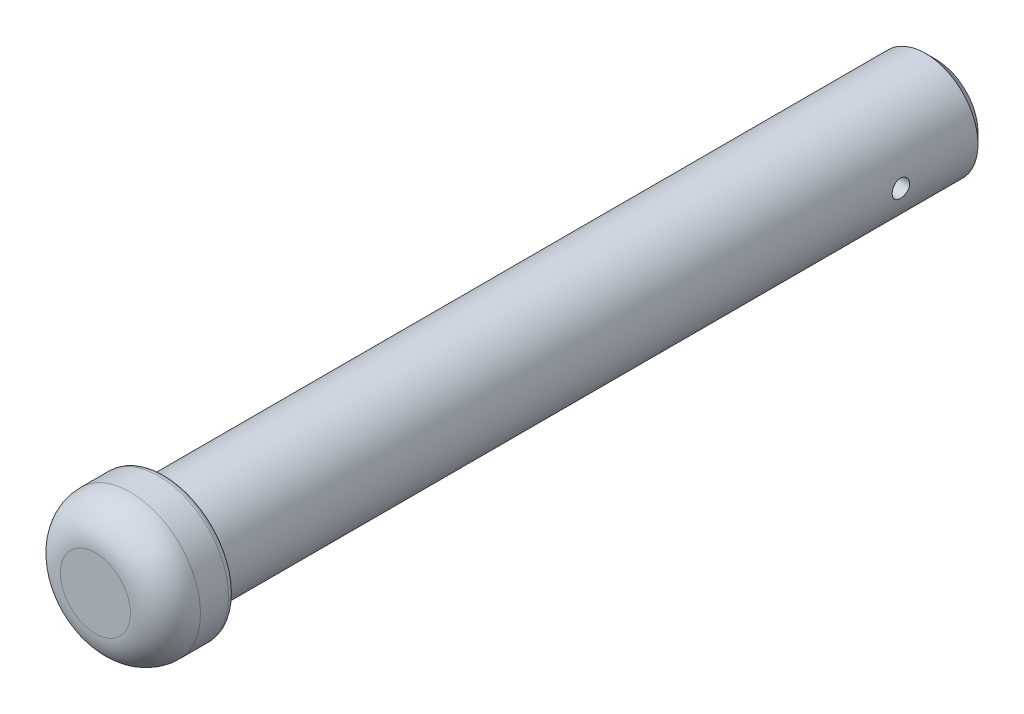
ISO-10303-21;
HEADER;
FILE_DESCRIPTION(('STEP AP214'),'2;1');
FILE_NAME('part.step','',(''),(''),'','','');
FILE_SCHEMA(('AUTOMOTIVE_DESIGN { 1 0 10303 214 1 1 1 1 }'));
ENDSEC;
DATA;
#1=APPLICATION_CONTEXT('core data for automotive mechanical design processes');
#2=APPLICATION_PROTOCOL_DEFINITION('international standard','automotive_design',2000,#1);
#3=PRODUCT_CONTEXT('',#1,'mechanical');
#4=PRODUCT('Part','Part','',(#3));
#5=PRODUCT_RELATED_PRODUCT_CATEGORY('part','',(#4));
#6=PRODUCT_DEFINITION_FORMATION('','',#4);
#7=PRODUCT_DEFINITION_CONTEXT('part definition',#1,'design');
#8=PRODUCT_DEFINITION('design','',#6,#7);
#9=PRODUCT_DEFINITION_SHAPE('','',#8);
#10=(LENGTH_UNIT() NAMED_UNIT(*) SI_UNIT(.MILLI.,.METRE.));
#11=(NAMED_UNIT(*) PLANE_ANGLE_UNIT() SI_UNIT($,.RADIAN.));
#12=(NAMED_UNIT(*) SI_UNIT($,.STERADIAN.) SOLID_ANGLE_UNIT());
#13=UNCERTAINTY_MEASURE_WITH_UNIT(LENGTH_MEASURE(1.E-05),#10,'distance_accuracy_value','');
#14=(GEOMETRIC_REPRESENTATION_CONTEXT(3) GLOBAL_UNCERTAINTY_ASSIGNED_CONTEXT((#13)) GLOBAL_UNIT_ASSIGNED_CONTEXT((#10,
#11,#12)) REPRESENTATION_CONTEXT('',''));
#15=CARTESIAN_POINT('',(0.,0.,0.));
#16=DIRECTION('',(0.,0.,1.));
#17=DIRECTION('',(1.,0.,0.));
#18=AXIS2_PLACEMENT_3D('',#15,#16,#17);
#19=CARTESIAN_POINT('',(0.,0.,220.));
#20=DIRECTION('',(0.,0.,-1.));
#21=DIRECTION('',(-1.,0.,0.));
#22=AXIS2_PLACEMENT_3D('',#19,#20,#21);
#23=CYLINDRICAL_SURFACE('',#22,15.);
#24=CARTESIAN_POINT('',(-15.,0.,27.5));
#25=CARTESIAN_POINT('',(-14.9999976116882,-0.139390904958215,27.4999944110522));
#26=CARTESIAN_POINT('',(-14.9980367791303,-0.278857881838821,27.4883027250311));
#27=CARTESIAN_POINT('',(-14.9904034494139,-0.553880221673043,27.4418643412347));
#28=CARTESIAN_POINT('',(-14.9847275392389,-0.689431867959247,27.4070964430884));
#29=CARTESIAN_POINT('',(-14.9703006823645,-0.952604747212643,27.3155845514072));
#30=CARTESIAN_POINT('',(-14.9615522515919,-1.0802323684319,27.2588585343594));
#31=CARTESIAN_POINT('',(-14.9419422708207,-1.32414184197794,27.1250877079476));
#32=CARTESIAN_POINT('',(-14.9310809625443,-1.44042498987859,27.048045222517));
#33=CARTESIAN_POINT('',(-14.9083331745831,-1.65947261429168,26.8750449161795));
#34=CARTESIAN_POINT('',(-14.8964387181486,-1.76211290353497,26.7789308853639));
#35=CARTESIAN_POINT('',(-14.8730262687673,-1.94988849865993,26.5708520315272));
#36=CARTESIAN_POINT('',(-14.8615082996267,-2.03502269939097,26.4588862085434));
#37=CARTESIAN_POINT('',(-14.8400756575978,-2.18586712560513,26.2214290338029));
#38=CARTESIAN_POINT('',(-14.8301712909164,-2.251454552861,26.0958586631952));
#39=CARTESIAN_POINT('',(-14.8131978979467,-2.36055836541122,25.8352904356994));
#40=CARTESIAN_POINT('',(-14.8061286801431,-2.40407624156561,25.7002932163224));
#41=CARTESIAN_POINT('',(-14.7957053684276,-2.46741437778481,25.4260197251435));
#42=CARTESIAN_POINT('',(-14.792317684857,-2.4874490291354,25.2867942634986));
#43=CARTESIAN_POINT('',(-14.7895393893665,-2.50391672528987,25.0069197231165));
#44=CARTESIAN_POINT('',(-14.7901484945721,-2.50035144038899,24.8662707458327));
#45=CARTESIAN_POINT('',(-14.7952642886355,-2.46989509839615,24.5890721387245));
#46=CARTESIAN_POINT('',(-14.7997307331892,-2.44324488188977,24.4524951964548));
#47=CARTESIAN_POINT('',(-14.8119949521101,-2.36775314040344,24.1857786821709));
#48=CARTESIAN_POINT('',(-14.8197928407327,-2.31891085431974,24.0556393311115));
#49=CARTESIAN_POINT('',(-14.837884793341,-2.20017724609391,23.8047711765591));
#50=CARTESIAN_POINT('',(-14.8481906710733,-2.13018591387971,23.6840905939188));
#51=CARTESIAN_POINT('',(-14.8701291841501,-1.97121201755743,23.4560955994616));
#52=CARTESIAN_POINT('',(-14.8817619265429,-1.88222792065429,23.3487822675451));
#53=CARTESIAN_POINT('',(-14.9052202787979,-1.68648221215905,23.1491739141927));
#54=CARTESIAN_POINT('',(-14.9170464923165,-1.57951396387313,23.0570814814599));
#55=CARTESIAN_POINT('',(-14.9394260139672,-1.35153524898165,22.8921222373347));
#56=CARTESIAN_POINT('',(-14.9499793138975,-1.23052469190642,22.8192555498168));
#57=CARTESIAN_POINT('',(-14.9686389289291,-0.977705916166711,22.6947977728637));
#58=CARTESIAN_POINT('',(-14.9767431840745,-0.845888725564661,22.6432245806687));
#59=CARTESIAN_POINT('',(-14.9895750301266,-0.57529834560273,22.563005784754));
#60=CARTESIAN_POINT('',(-14.9943029035047,-0.436525739179466,22.5343582630263));
#61=CARTESIAN_POINT('',(-14.9998112984269,-0.157709901301621,22.5010786415389));
#62=CARTESIAN_POINT('',(-15.0006375301278,-0.0177007371510094,22.4961684281944));
#63=CARTESIAN_POINT('',(-14.9983747442117,0.261139772889889,22.5097613444281));
#64=CARTESIAN_POINT('',(-14.9952858772412,0.399971163892039,22.5282635731337));
#65=CARTESIAN_POINT('',(-14.985568269382,0.671656175546764,22.5879248493355));
#66=CARTESIAN_POINT('',(-14.9789610480131,0.804540868385379,22.6289462083901));
#67=CARTESIAN_POINT('',(-14.9629446445536,1.06154688486044,22.7323345181995));
#68=CARTESIAN_POINT('',(-14.9535353051202,1.18566771590972,22.7947026676353));
#69=CARTESIAN_POINT('',(-14.9328451630241,1.42283068946896,22.9396511246968));
#70=CARTESIAN_POINT('',(-14.9215485588702,1.53576525093715,23.0224051561673));
#71=CARTESIAN_POINT('',(-14.898384673919,1.74624358550269,23.2055373153851));
#72=CARTESIAN_POINT('',(-14.8865173517155,1.84378623969658,23.3059167232767));
#73=CARTESIAN_POINT('',(-14.8634017523585,2.021742779658,23.5226975480714));
#74=CARTESIAN_POINT('',(-14.8521611613711,2.10196876111371,23.6392541655144));
#75=CARTESIAN_POINT('',(-14.8317152977788,2.24170231029498,23.8843529691385));
#76=CARTESIAN_POINT('',(-14.8225099606602,2.30121053476982,24.0128947752275));
#77=CARTESIAN_POINT('',(-14.807234536977,2.39753833147315,24.2777897328121));
#78=CARTESIAN_POINT('',(-14.8011515431106,2.43445143254794,24.4141080950305));
#79=CARTESIAN_POINT('',(-14.7927771683526,2.48483545377828,24.6911201292218));
#80=CARTESIAN_POINT('',(-14.7904854578272,2.49830841194617,24.8318134197321));
#81=CARTESIAN_POINT('',(-14.7899673308401,2.50137286604735,25.1117051659624));
#82=CARTESIAN_POINT('',(-14.7916905650565,2.49126013612519,25.2509003785753));
#83=CARTESIAN_POINT('',(-14.7988978145373,2.44807983895685,25.5255792480508));
#84=CARTESIAN_POINT('',(-14.8043818176121,2.41501234611248,25.6610629169419));
#85=CARTESIAN_POINT('',(-14.8184735628172,2.3269744895949,25.9243584372926));
#86=CARTESIAN_POINT('',(-14.8270776721967,2.27202959060044,26.052179010056));
#87=CARTESIAN_POINT('',(-14.8464436892221,2.14182700391591,26.2968356691948));
#88=CARTESIAN_POINT('',(-14.857205703884,2.06656830874856,26.4136712103721));
#89=CARTESIAN_POINT('',(-14.8798345404562,1.89681888437216,26.6345355831078));
#90=CARTESIAN_POINT('',(-14.891712955763,1.80211056359365,26.7383960167003));
#91=CARTESIAN_POINT('',(-14.9151437236084,1.59660903138023,26.9288516044749));
#92=CARTESIAN_POINT('',(-14.9266960002655,1.48581211291263,27.0154427686382));
#93=CARTESIAN_POINT('',(-14.9482652964222,1.25036916964028,27.1694482681999));
#94=CARTESIAN_POINT('',(-14.958271162531,1.12563278753282,27.236726039313));
#95=CARTESIAN_POINT('',(-14.9755116760178,0.866513069378982,27.3492694846099));
#96=CARTESIAN_POINT('',(-14.9827490817748,0.73213949483001,27.3945570810797));
#97=CARTESIAN_POINT('',(-14.9920579083296,0.497703310045402,27.4520052741267));
#98=CARTESIAN_POINT('',(-14.9950202727336,0.399058830298448,27.469974469616));
#99=CARTESIAN_POINT('',(-14.9989921598612,0.20028931031981,27.4939737378448));
#100=CARTESIAN_POINT('',(-15.0000017162064,0.100164295608494,27.5000040161374));
#101=CARTESIAN_POINT('',(-15.,0.,27.5));
#102=B_SPLINE_CURVE_WITH_KNOTS('',3,(#24,#25,#26,#27,#28,#29,#30,#31,#32,#33,#34,#35,#36,#37,
#38,#39,#40,#41,#42,#43,#44,#45,#46,#47,#48,#49,#50,#51,#52,#53,#54,#55,#56,#57,#58,#59,#60,#61,
#62,#63,#64,#65,#66,#67,#68,#69,#70,#71,#72,#73,#74,#75,#76,#77,#78,#79,#80,#81,#82,#83,#84,#85,
#86,#87,#88,#89,#90,#91,#92,#93,#94,#95,#96,#97,#98,#99,#100,#101),.UNSPECIFIED.,.T.,.F.,(4,2,2,
2,2,2,2,2,2,2,2,2,2,2,2,2,2,2,2,2,2,2,2,2,2,2,2,2,2,2,2,2,2,2,2,2,2,2,4),(0.,0.417806584938509,
0.835997545695419,1.25384686702527,1.67164841267479,2.09302491062332,2.51442800169857,
2.9384252082384,3.36239376876181,3.78246077103424,4.20249804320886,4.61820521760409,
5.03392665025381,5.45164556632557,5.86939820680573,6.29232769911326,6.71525991635847,
7.13854688915903,7.56179844521149,7.98007883491397,8.39834313035859,8.81407807006415,
9.22983635826066,9.64926825627023,10.0687306305428,10.4925382200762,10.9163323737594,
11.3383602234177,11.7603513778662,12.177079095227,12.5938054618813,13.0100481822622,
13.4263115502933,13.8475138419339,14.2688133387897,14.693022316072,15.1168075213007,
15.4170424816402,15.7172722727697),.UNSPECIFIED.);
#103=CARTESIAN_POINT('',(-15.,0.,27.5));
#104=VERTEX_POINT('',#103);
#105=EDGE_CURVE('E44',#104,#104,#102,.T.);
#106=ORIENTED_EDGE('',*,*,#105,.T.);
#107=EDGE_LOOP('',(#106));
#108=FACE_BOUND('',#107,.T.);
#109=CARTESIAN_POINT('',(15.,0.,22.5));
#110=CARTESIAN_POINT('',(14.9999976116882,-0.139390904958215,22.5000055889478));
#111=CARTESIAN_POINT('',(14.9980367791303,-0.278857881838821,22.5116972749689));
#112=CARTESIAN_POINT('',(14.9904034494139,-0.553880221673042,22.5581356587653));
#113=CARTESIAN_POINT('',(14.9847275392389,-0.689431867959247,22.5929035569116));
#114=CARTESIAN_POINT('',(14.9703006823645,-0.952604747212644,22.6844154485928));
#115=CARTESIAN_POINT('',(14.9615522515919,-1.0802323684319,22.7411414656406));
#116=CARTESIAN_POINT('',(14.9419422708207,-1.32414184197794,22.8749122920524));
#117=CARTESIAN_POINT('',(14.9310809625443,-1.44042498987859,22.951954777483));
#118=CARTESIAN_POINT('',(14.9083331745831,-1.65947261429168,23.1249550838205));
#119=CARTESIAN_POINT('',(14.8964387181486,-1.76211290353497,23.2210691146361));
#120=CARTESIAN_POINT('',(14.8730262687673,-1.94988849865993,23.4291479684728));
#121=CARTESIAN_POINT('',(14.8615082996267,-2.03502269939097,23.5411137914566));
#122=CARTESIAN_POINT('',(14.8400756575978,-2.18586712560513,23.7785709661971));
#123=CARTESIAN_POINT('',(14.8301712909164,-2.251454552861,23.9041413368048));
#124=CARTESIAN_POINT('',(14.8131978979467,-2.36055836541122,24.1647095643006));
#125=CARTESIAN_POINT('',(14.8061286801431,-2.40407624156561,24.2997067836776));
#126=CARTESIAN_POINT('',(14.7957053684276,-2.46741437778481,24.5739802748565));
#127=CARTESIAN_POINT('',(14.792317684857,-2.4874490291354,24.7132057365014));
#128=CARTESIAN_POINT('',(14.7895393893665,-2.50391672528987,24.9930802768835));
#129=CARTESIAN_POINT('',(14.7901484945721,-2.50035144038899,25.1337292541673));
#130=CARTESIAN_POINT('',(14.7952642886355,-2.46989509839615,25.4109278612755));
#131=CARTESIAN_POINT('',(14.7997307331892,-2.44324488188977,25.5475048035452));
#132=CARTESIAN_POINT('',(14.8119949521101,-2.36775314040344,25.8142213178291));
#133=CARTESIAN_POINT('',(14.8197928407327,-2.31891085431974,25.9443606688885));
#134=CARTESIAN_POINT('',(14.837884793341,-2.20017724609391,26.1952288234409));
#135=CARTESIAN_POINT('',(14.8481906710733,-2.13018591387971,26.3159094060812));
#136=CARTESIAN_POINT('',(14.8701291841501,-1.97121201755743,26.5439044005384));
#137=CARTESIAN_POINT('',(14.8817619265429,-1.88222792065429,26.6512177324549));
#138=CARTESIAN_POINT('',(14.9052202787979,-1.68648221215905,26.8508260858073));
#139=CARTESIAN_POINT('',(14.9170464923165,-1.57951396387313,26.9429185185401));
#140=CARTESIAN_POINT('',(14.9394260139672,-1.35153524898165,27.1078777626653));
#141=CARTESIAN_POINT('',(14.9499793138975,-1.23052469190642,27.1807444501832));
#142=CARTESIAN_POINT('',(14.9686389289291,-0.977705916166711,27.3052022271363));
#143=CARTESIAN_POINT('',(14.9767431840745,-0.845888725564661,27.3567754193313));
#144=CARTESIAN_POINT('',(14.9895750301266,-0.57529834560273,27.436994215246));
#145=CARTESIAN_POINT('',(14.9943029035047,-0.436525739179467,27.4656417369737));
#146=CARTESIAN_POINT('',(14.9998112984269,-0.157709901301622,27.4989213584611));
#147=CARTESIAN_POINT('',(15.0006375301278,-0.0177007371510099,27.5038315718056));
#148=CARTESIAN_POINT('',(14.9983747442117,0.261139772889888,27.4902386555719));
#149=CARTESIAN_POINT('',(14.9952858772412,0.399971163892039,27.4717364268663));
#150=CARTESIAN_POINT('',(14.985568269382,0.671656175546763,27.4120751506645));
#151=CARTESIAN_POINT('',(14.9789610480131,0.804540868385378,27.3710537916099));
#152=CARTESIAN_POINT('',(14.9629446445536,1.06154688486044,27.2676654818005));
#153=CARTESIAN_POINT('',(14.9535353051202,1.18566771590972,27.2052973323647));
#154=CARTESIAN_POINT('',(14.9328451630241,1.42283068946895,27.0603488753032));
#155=CARTESIAN_POINT('',(14.9215485588702,1.53576525093714,26.9775948438328));
#156=CARTESIAN_POINT('',(14.898384673919,1.74624358550268,26.7944626846149));
#157=CARTESIAN_POINT('',(14.8865173517155,1.84378623969658,26.6940832767233));
#158=CARTESIAN_POINT('',(14.8634017523585,2.021742779658,26.4773024519286));
#159=CARTESIAN_POINT('',(14.8521611613711,2.10196876111371,26.3607458344856));
#160=CARTESIAN_POINT('',(14.8317152977788,2.24170231029498,26.1156470308615));
#161=CARTESIAN_POINT('',(14.8225099606602,2.30121053476982,25.9871052247725));
#162=CARTESIAN_POINT('',(14.807234536977,2.39753833147315,25.7222102671879));
#163=CARTESIAN_POINT('',(14.8011515431106,2.43445143254794,25.5858919049695));
#164=CARTESIAN_POINT('',(14.7927771683526,2.48483545377828,25.3088798707782));
#165=CARTESIAN_POINT('',(14.7904854578272,2.49830841194617,25.1681865802679));
#166=CARTESIAN_POINT('',(14.7899673308401,2.50137286604735,24.8882948340376));
#167=CARTESIAN_POINT('',(14.7916905650565,2.49126013612519,24.7490996214247));
#168=CARTESIAN_POINT('',(14.7988978145373,2.44807983895685,24.4744207519492));
#169=CARTESIAN_POINT('',(14.8043818176121,2.41501234611248,24.3389370830581));
#170=CARTESIAN_POINT('',(14.8184735628172,2.3269744895949,24.0756415627074));
#171=CARTESIAN_POINT('',(14.8270776721967,2.27202959060044,23.947820989944));
#172=CARTESIAN_POINT('',(14.8464436892221,2.14182700391591,23.7031643308052));
#173=CARTESIAN_POINT('',(14.857205703884,2.06656830874856,23.5863287896279));
#174=CARTESIAN_POINT('',(14.8798345404562,1.89681888437216,23.3654644168922));
#175=CARTESIAN_POINT('',(14.891712955763,1.80211056359365,23.2616039832997));
#176=CARTESIAN_POINT('',(14.9151437236084,1.59660903138023,23.0711483955251));
#177=CARTESIAN_POINT('',(14.9266960002655,1.48581211291264,22.9845572313618));
#178=CARTESIAN_POINT('',(14.9482652964222,1.25036916964028,22.8305517318001));
#179=CARTESIAN_POINT('',(14.958271162531,1.12563278753282,22.7632739606871));
#180=CARTESIAN_POINT('',(14.9755116760178,0.866513069378983,22.6507305153901));
#181=CARTESIAN_POINT('',(14.9827490817748,0.732139494830011,22.6054429189203));
#182=CARTESIAN_POINT('',(14.9920579083296,0.497703310045402,22.5479947258733));
#183=CARTESIAN_POINT('',(14.9950202727336,0.399058830298448,22.530025530384));
#184=CARTESIAN_POINT('',(14.9989921598612,0.200289310319809,22.5060262621552));
#185=CARTESIAN_POINT('',(15.0000017162064,0.100164295608494,22.4999959838626));
#186=CARTESIAN_POINT('',(15.,0.,22.5));
#187=B_SPLINE_CURVE_WITH_KNOTS('',3,(#109,#110,#111,#112,#113,#114,#115,#116,#117,#118,#119,
#120,#121,#122,#123,#124,#125,#126,#127,#128,#129,#130,#131,#132,#133,#134,#135,#136,#137,#138,
#139,#140,#141,#142,#143,#144,#145,#146,#147,#148,#149,#150,#151,#152,#153,#154,#155,#156,#157,
#158,#159,#160,#161,#162,#163,#164,#165,#166,#167,#168,#169,#170,#171,#172,#173,#174,#175,#176,
#177,#178,#179,#180,#181,#182,#183,#184,#185,#186),.UNSPECIFIED.,.T.,.F.,(4,2,2,2,2,2,2,2,2,2,2,
2,2,2,2,2,2,2,2,2,2,2,2,2,2,2,2,2,2,2,2,2,2,2,2,2,2,2,4),(0.,0.417806584938509,0.83599754569542,
1.25384686702527,1.67164841267479,2.09302491062332,2.51442800169857,2.9384252082384,
3.36239376876181,3.78246077103424,4.20249804320887,4.61820521760408,5.03392665025381,
5.45164556632557,5.86939820680573,6.29232769911326,6.71525991635847,7.13854688915903,
7.56179844521149,7.98007883491397,8.39834313035859,8.81407807006415,9.22983635826066,
9.64926825627023,10.0687306305428,10.4925382200762,10.9163323737594,11.3383602234177,
11.7603513778662,12.177079095227,12.5938054618813,13.0100481822622,13.4263115502934,
13.8475138419339,14.2688133387897,14.693022316072,15.1168075213007,15.4170424816402,
15.7172722727697),.UNSPECIFIED.);
#188=CARTESIAN_POINT('',(15.,0.,22.5));
#189=VERTEX_POINT('',#188);
#190=EDGE_CURVE('E61',#189,#189,#187,.T.);
#191=ORIENTED_EDGE('',*,*,#190,.T.);
#192=EDGE_LOOP('',(#191));
#193=FACE_BOUND('',#192,.T.);
#194=CARTESIAN_POINT('',(0.,0.,3.));
#195=DIRECTION('',(0.,0.,1.));
#196=DIRECTION('',(1.,0.,0.));
#197=AXIS2_PLACEMENT_3D('',#194,#195,#196);
#198=CIRCLE('',#197,15.);
#199=CARTESIAN_POINT('',(15.,0.,3.));
#200=VERTEX_POINT('',#199);
#201=EDGE_CURVE('E53',#200,#200,#198,.T.);
#202=ORIENTED_EDGE('',*,*,#201,.T.);
#203=EDGE_LOOP('',(#202));
#204=FACE_BOUND('',#203,.T.);
#205=CARTESIAN_POINT('',(0.,0.,218.));
#206=DIRECTION('',(0.,0.,1.));
#207=DIRECTION('',(1.,0.,0.));
#208=AXIS2_PLACEMENT_3D('',#205,#206,#207);
#209=CIRCLE('',#208,15.);
#210=CARTESIAN_POINT('',(15.,0.,218.));
#211=VERTEX_POINT('',#210);
#212=EDGE_CURVE('E106',#211,#211,#209,.F.);
#213=ORIENTED_EDGE('',*,*,#212,.T.);
#214=EDGE_LOOP('',(#213));
#215=FACE_BOUND('',#214,.T.);
#216=ADVANCED_FACE('F39',(#108,#193,#204,#215),#23,.T.);
#217=CARTESIAN_POINT('',(0.,0.,0.));
#218=DIRECTION('',(0.,0.,1.));
#219=DIRECTION('',(1.,0.,0.));
#220=AXIS2_PLACEMENT_3D('',#217,#218,#219);
#221=PLANE('',#220);
#222=CARTESIAN_POINT('',(0.,0.,0.));
#223=DIRECTION('',(0.,0.,1.));
#224=DIRECTION('',(1.,0.,0.));
#225=AXIS2_PLACEMENT_3D('',#222,#223,#224);
#226=CIRCLE('',#225,12.);
#227=CARTESIAN_POINT('',(12.,0.,0.));
#228=VERTEX_POINT('',#227);
#229=EDGE_CURVE('E10',#228,#228,#226,.F.);
#230=ORIENTED_EDGE('',*,*,#229,.T.);
#231=EDGE_LOOP('',(#230));
#232=FACE_BOUND('',#231,.T.);
#233=ADVANCED_FACE('F86',(#232),#221,.F.);
#234=CARTESIAN_POINT('',(0.,0.,240.));
#235=DIRECTION('',(0.,0.,-1.));
#236=DIRECTION('',(-1.,0.,0.));
#237=AXIS2_PLACEMENT_3D('',#234,#235,#236);
#238=CYLINDRICAL_SURFACE('',#237,20.);
#239=CARTESIAN_POINT('',(0.,0.,222.));
#240=DIRECTION('',(0.,0.,1.));
#241=DIRECTION('',(1.,0.,0.));
#242=AXIS2_PLACEMENT_3D('',#239,#240,#241);
#243=CIRCLE('',#242,20.);
#244=CARTESIAN_POINT('',(20.,0.,222.));
#245=VERTEX_POINT('',#244);
#246=EDGE_CURVE('E58',#245,#245,#243,.T.);
#247=ORIENTED_EDGE('',*,*,#246,.T.);
#248=EDGE_LOOP('',(#247));
#249=FACE_BOUND('',#248,.T.);
#250=CARTESIAN_POINT('',(0.,0.,230.));
#251=DIRECTION('',(0.,0.,1.));
#252=DIRECTION('',(1.,0.,0.));
#253=AXIS2_PLACEMENT_3D('',#250,#251,#252);
#254=CIRCLE('',#253,20.);
#255=CARTESIAN_POINT('',(20.,0.,230.));
#256=VERTEX_POINT('',#255);
#257=EDGE_CURVE('E117',#256,#256,#254,.F.);
#258=ORIENTED_EDGE('',*,*,#257,.T.);
#259=EDGE_LOOP('',(#258));
#260=FACE_BOUND('',#259,.T.);
#261=ADVANCED_FACE('F79',(#249,#260),#238,.T.);
#262=CARTESIAN_POINT('',(0.,0.,240.));
#263=DIRECTION('',(0.,0.,1.));
#264=DIRECTION('',(1.,0.,0.));
#265=AXIS2_PLACEMENT_3D('',#262,#263,#264);
#266=PLANE('',#265);
#267=CARTESIAN_POINT('',(0.,0.,240.));
#268=DIRECTION('',(0.,0.,1.));
#269=DIRECTION('',(1.,0.,0.));
#270=AXIS2_PLACEMENT_3D('',#267,#268,#269);
#271=CIRCLE('',#270,10.);
#272=CARTESIAN_POINT('',(10.,0.,240.));
#273=VERTEX_POINT('',#272);
#274=EDGE_CURVE('E120',#273,#273,#271,.T.);
#275=ORIENTED_EDGE('',*,*,#274,.T.);
#276=EDGE_LOOP('',(#275));
#277=FACE_BOUND('',#276,.T.);
#278=ADVANCED_FACE('F74',(#277),#266,.T.);
#279=CARTESIAN_POINT('',(0.,0.,220.));
#280=DIRECTION('',(0.,0.,1.));
#281=DIRECTION('',(1.,0.,0.));
#282=AXIS2_PLACEMENT_3D('',#279,#280,#281);
#283=PLANE('',#282);
#284=CARTESIAN_POINT('',(0.,0.,220.));
#285=DIRECTION('',(0.,0.,1.));
#286=DIRECTION('',(1.,0.,0.));
#287=AXIS2_PLACEMENT_3D('',#284,#285,#286);
#288=CIRCLE('',#287,17.);
#289=CARTESIAN_POINT('',(17.,0.,220.));
#290=VERTEX_POINT('',#289);
#291=EDGE_CURVE('E108',#290,#290,#288,.T.);
#292=ORIENTED_EDGE('',*,*,#291,.T.);
#293=EDGE_LOOP('',(#292));
#294=FACE_BOUND('',#293,.T.);
#295=CARTESIAN_POINT('',(0.,0.,220.));
#296=DIRECTION('',(0.,0.,1.));
#297=DIRECTION('',(1.,0.,0.));
#298=AXIS2_PLACEMENT_3D('',#295,#296,#297);
#299=CIRCLE('',#298,18.);
#300=CARTESIAN_POINT('',(18.,0.,220.));
#301=VERTEX_POINT('',#300);
#302=EDGE_CURVE('E112',#301,#301,#299,.F.);
#303=ORIENTED_EDGE('',*,*,#302,.T.);
#304=EDGE_LOOP('',(#303));
#305=FACE_BOUND('',#304,.T.);
#306=ADVANCED_FACE('F78',(#294,#305),#283,.F.);
#307=CARTESIAN_POINT('',(0.,0.,230.));
#308=DIRECTION('',(0.,0.,1.));
#309=DIRECTION('',(1.,0.,0.));
#310=AXIS2_PLACEMENT_3D('',#307,#308,#309);
#311=DEGENERATE_TOROIDAL_SURFACE('',#310,10.,10.,.T.);
#312=ORIENTED_EDGE('',*,*,#257,.F.);
#313=EDGE_LOOP('',(#312));
#314=FACE_BOUND('',#313,.T.);
#315=ORIENTED_EDGE('',*,*,#274,.F.);
#316=EDGE_LOOP('',(#315));
#317=FACE_BOUND('',#316,.T.);
#318=ADVANCED_FACE('F83',(#314,#317),#311,.T.);
#319=CARTESIAN_POINT('',(0.,0.,218.));
#320=DIRECTION('',(0.,0.,1.));
#321=DIRECTION('',(1.,0.,0.));
#322=AXIS2_PLACEMENT_3D('',#319,#320,#321);
#323=TOROIDAL_SURFACE('',#322,17.,2.);
#324=ORIENTED_EDGE('',*,*,#212,.F.);
#325=EDGE_LOOP('',(#324));
#326=FACE_BOUND('',#325,.T.);
#327=ORIENTED_EDGE('',*,*,#291,.F.);
#328=EDGE_LOOP('',(#327));
#329=FACE_BOUND('',#328,.T.);
#330=ADVANCED_FACE('F125',(#326,#329),#323,.F.);
#331=CARTESIAN_POINT('',(0.,0.,222.));
#332=DIRECTION('',(0.,0.,1.));
#333=DIRECTION('',(1.,0.,0.));
#334=AXIS2_PLACEMENT_3D('',#331,#332,#333);
#335=TOROIDAL_SURFACE('',#334,18.,2.);
#336=ORIENTED_EDGE('',*,*,#302,.F.);
#337=EDGE_LOOP('',(#336));
#338=FACE_BOUND('',#337,.T.);
#339=ORIENTED_EDGE('',*,*,#246,.F.);
#340=EDGE_LOOP('',(#339));
#341=FACE_BOUND('',#340,.T.);
#342=ADVANCED_FACE('F130',(#338,#341),#335,.T.);
#343=CARTESIAN_POINT('',(0.,0.,3.));
#344=DIRECTION('',(0.,0.,1.));
#345=DIRECTION('',(1.,0.,0.));
#346=AXIS2_PLACEMENT_3D('',#343,#344,#345);
#347=CONICAL_SURFACE('',#346,15.,0.785398163397446);
#348=ORIENTED_EDGE('',*,*,#229,.F.);
#349=EDGE_LOOP('',(#348));
#350=FACE_BOUND('',#349,.T.);
#351=ORIENTED_EDGE('',*,*,#201,.F.);
#352=EDGE_LOOP('',(#351));
#353=FACE_BOUND('',#352,.T.);
#354=ADVANCED_FACE('F42',(#350,#353),#347,.T.);
#355=CARTESIAN_POINT('',(-20.,0.,25.));
#356=DIRECTION('',(1.,0.,0.));
#357=DIRECTION('',(0.,0.,-1.));
#358=AXIS2_PLACEMENT_3D('',#355,#356,#357);
#359=CYLINDRICAL_SURFACE('',#358,2.5);
#360=ORIENTED_EDGE('',*,*,#190,.F.);
#361=EDGE_LOOP('',(#360));
#362=FACE_BOUND('',#361,.T.);
#363=ORIENTED_EDGE('',*,*,#105,.F.);
#364=EDGE_LOOP('',(#363));
#365=FACE_BOUND('',#364,.T.);
#366=ADVANCED_FACE('F69',(#362,#365),#359,.F.);
#367=CLOSED_SHELL('',(#216,#233,#261,#278,#306,#318,#330,#342,#354,#366));
#368=MANIFOLD_SOLID_BREP('B2',#367);
#369=ADVANCED_BREP_SHAPE_REPRESENTATION('',(#18,#368),#14);
#370=SHAPE_DEFINITION_REPRESENTATION(#9,#369);
ENDSEC;
END-ISO-10303-21;
